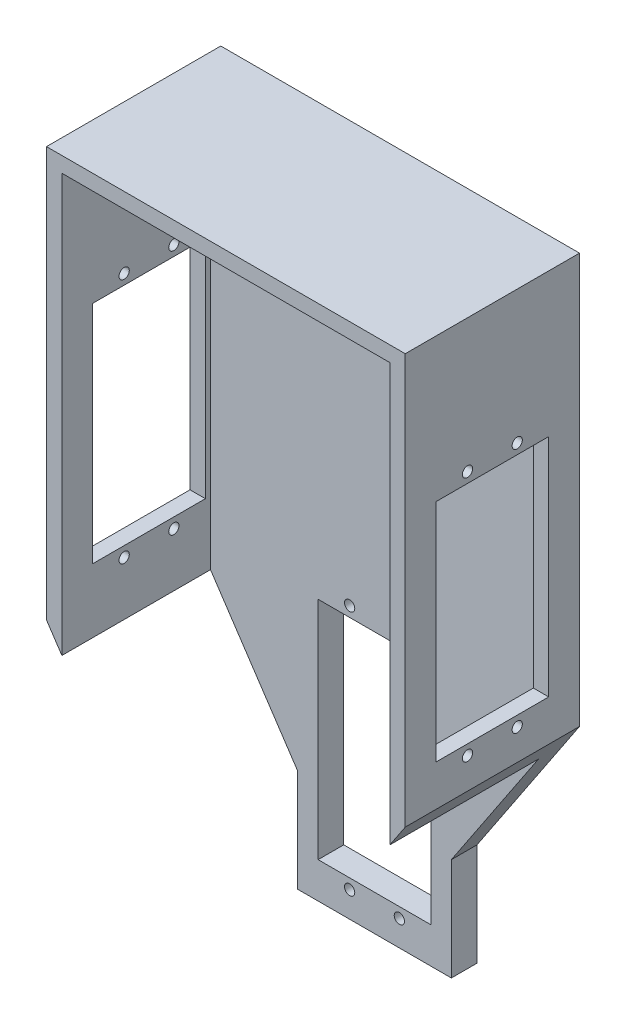
ISO-10303-21;
HEADER;
FILE_DESCRIPTION(('STEP AP214'),'2;1');
FILE_NAME('part.step','',(''),(''),'','','');
FILE_SCHEMA(('AUTOMOTIVE_DESIGN { 1 0 10303 214 1 1 1 1 }'));
ENDSEC;
DATA;
#1=APPLICATION_CONTEXT('core data for automotive mechanical design processes');
#2=APPLICATION_PROTOCOL_DEFINITION('international standard','automotive_design',2000,#1);
#3=PRODUCT_CONTEXT('',#1,'mechanical');
#4=PRODUCT('Part','Part','',(#3));
#5=PRODUCT_RELATED_PRODUCT_CATEGORY('part','',(#4));
#6=PRODUCT_DEFINITION_FORMATION('','',#4);
#7=PRODUCT_DEFINITION_CONTEXT('part definition',#1,'design');
#8=PRODUCT_DEFINITION('design','',#6,#7);
#9=PRODUCT_DEFINITION_SHAPE('','',#8);
#10=(LENGTH_UNIT() NAMED_UNIT(*) SI_UNIT(.MILLI.,.METRE.));
#11=(NAMED_UNIT(*) PLANE_ANGLE_UNIT() SI_UNIT($,.RADIAN.));
#12=(NAMED_UNIT(*) SI_UNIT($,.STERADIAN.) SOLID_ANGLE_UNIT());
#13=UNCERTAINTY_MEASURE_WITH_UNIT(LENGTH_MEASURE(1.E-05),#10,'distance_accuracy_value','');
#14=(GEOMETRIC_REPRESENTATION_CONTEXT(3) GLOBAL_UNCERTAINTY_ASSIGNED_CONTEXT((#13)) GLOBAL_UNIT_ASSIGNED_CONTEXT((#10,
#11,#12)) REPRESENTATION_CONTEXT('',''));
#15=CARTESIAN_POINT('',(0.,0.,0.));
#16=DIRECTION('',(0.,0.,1.));
#17=DIRECTION('',(1.,0.,0.));
#18=AXIS2_PLACEMENT_3D('',#15,#16,#17);
#19=CARTESIAN_POINT('',(0.,0.,2.5));
#20=DIRECTION('',(0.,0.,1.));
#21=DIRECTION('',(1.,0.,0.));
#22=AXIS2_PLACEMENT_3D('',#19,#20,#21);
#23=PLANE('',#22);
#24=CARTESIAN_POINT('',(4.84999999999983,24.,2.5));
#25=DIRECTION('',(0.,0.,1.));
#26=DIRECTION('',(1.,0.,0.));
#27=AXIS2_PLACEMENT_3D('',#24,#25,#26);
#28=CIRCLE('',#27,1.);
#29=CARTESIAN_POINT('',(5.84999999999983,24.,2.5));
#30=VERTEX_POINT('',#29);
#31=EDGE_CURVE('E347',#30,#30,#28,.T.);
#32=ORIENTED_EDGE('',*,*,#31,.F.);
#33=EDGE_LOOP('',(#32));
#34=FACE_BOUND('',#33,.T.);
#35=CARTESIAN_POINT('',(-4.85,-24.,2.5));
#36=DIRECTION('',(0.,0.,1.));
#37=DIRECTION('',(1.,0.,0.));
#38=AXIS2_PLACEMENT_3D('',#35,#36,#37);
#39=CIRCLE('',#38,1.);
#40=CARTESIAN_POINT('',(-3.85,-24.,2.5));
#41=VERTEX_POINT('',#40);
#42=EDGE_CURVE('E363',#41,#41,#39,.T.);
#43=ORIENTED_EDGE('',*,*,#42,.F.);
#44=EDGE_LOOP('',(#43));
#45=FACE_BOUND('',#44,.T.);
#46=DIRECTION('',(1.,0.,0.));
#47=VECTOR('',#46,1.);
#48=CARTESIAN_POINT('',(11.,-22.,2.5));
#49=LINE('',#48,#47);
#50=CARTESIAN_POINT('',(-11.,-22.,2.5));
#51=VERTEX_POINT('',#50);
#52=CARTESIAN_POINT('',(11.,-22.,2.5));
#53=VERTEX_POINT('',#52);
#54=EDGE_CURVE('E374',#51,#53,#49,.T.);
#55=ORIENTED_EDGE('',*,*,#54,.F.);
#56=DIRECTION('',(0.,-1.,0.));
#57=VECTOR('',#56,1.);
#58=CARTESIAN_POINT('',(-11.,-22.,2.5));
#59=LINE('',#58,#57);
#60=CARTESIAN_POINT('',(-11.,22.,2.5));
#61=VERTEX_POINT('',#60);
#62=EDGE_CURVE('E371',#61,#51,#59,.T.);
#63=ORIENTED_EDGE('',*,*,#62,.F.);
#64=DIRECTION('',(-1.,0.,0.));
#65=VECTOR('',#64,1.);
#66=CARTESIAN_POINT('',(11.,22.,2.5));
#67=LINE('',#66,#65);
#68=CARTESIAN_POINT('',(11.,22.,2.5));
#69=VERTEX_POINT('',#68);
#70=EDGE_CURVE('E382',#69,#61,#67,.T.);
#71=ORIENTED_EDGE('',*,*,#70,.F.);
#72=DIRECTION('',(0.,1.,0.));
#73=VECTOR('',#72,1.);
#74=CARTESIAN_POINT('',(11.,-22.,2.5));
#75=LINE('',#74,#73);
#76=EDGE_CURVE('E378',#53,#69,#75,.T.);
#77=ORIENTED_EDGE('',*,*,#76,.F.);
#78=EDGE_LOOP('',(#55,#63,#71,#77));
#79=FACE_BOUND('',#78,.T.);
#80=CARTESIAN_POINT('',(4.85,-24.,2.5));
#81=DIRECTION('',(0.,0.,1.));
#82=DIRECTION('',(1.,0.,0.));
#83=AXIS2_PLACEMENT_3D('',#80,#81,#82);
#84=CIRCLE('',#83,1.);
#85=CARTESIAN_POINT('',(5.85,-24.,2.5));
#86=VERTEX_POINT('',#85);
#87=EDGE_CURVE('E355',#86,#86,#84,.T.);
#88=ORIENTED_EDGE('',*,*,#87,.F.);
#89=EDGE_LOOP('',(#88));
#90=FACE_BOUND('',#89,.T.);
#91=CARTESIAN_POINT('',(-4.85000000000016,24.,2.5));
#92=DIRECTION('',(0.,0.,1.));
#93=DIRECTION('',(1.,0.,0.));
#94=AXIS2_PLACEMENT_3D('',#91,#92,#93);
#95=CIRCLE('',#94,1.);
#96=CARTESIAN_POINT('',(-3.85000000000016,24.,2.5));
#97=VERTEX_POINT('',#96);
#98=EDGE_CURVE('E339',#97,#97,#95,.T.);
#99=ORIENTED_EDGE('',*,*,#98,.F.);
#100=EDGE_LOOP('',(#99));
#101=FACE_BOUND('',#100,.T.);
#102=DIRECTION('',(-1.,0.,0.));
#103=VECTOR('',#102,1.);
#104=CARTESIAN_POINT('',(0.,98.,2.5));
#105=LINE('',#104,#103);
#106=CARTESIAN_POINT('',(32.,98.,2.5));
#107=VERTEX_POINT('',#106);
#108=CARTESIAN_POINT('',(-32.,98.,2.5));
#109=VERTEX_POINT('',#108);
#110=EDGE_CURVE('E335',#107,#109,#105,.T.);
#111=ORIENTED_EDGE('',*,*,#110,.T.);
#112=DIRECTION('',(0.,-1.,0.));
#113=VECTOR('',#112,1.);
#114=CARTESIAN_POINT('',(-32.,0.,2.5));
#115=LINE('',#114,#113);
#116=CARTESIAN_POINT('',(-32.,16.5,2.5));
#117=VERTEX_POINT('',#116);
#118=EDGE_CURVE('E329',#109,#117,#115,.T.);
#119=ORIENTED_EDGE('',*,*,#118,.T.);
#120=DIRECTION('',(0.554700196225229,-0.832050294337843,0.));
#121=VECTOR('',#120,1.);
#122=CARTESIAN_POINT('',(-35.,21.,2.5));
#123=LINE('',#122,#121);
#124=CARTESIAN_POINT('',(-15.,-9.,2.5));
#125=VERTEX_POINT('',#124);
#126=EDGE_CURVE('E428',#117,#125,#123,.T.);
#127=ORIENTED_EDGE('',*,*,#126,.T.);
#128=DIRECTION('',(0.,-1.,0.));
#129=VECTOR('',#128,1.);
#130=CARTESIAN_POINT('',(-15.,-9.,2.5));
#131=LINE('',#130,#129);
#132=CARTESIAN_POINT('',(-15.,-29.,2.5));
#133=VERTEX_POINT('',#132);
#134=EDGE_CURVE('E414',#125,#133,#131,.T.);
#135=ORIENTED_EDGE('',*,*,#134,.T.);
#136=DIRECTION('',(1.,0.,0.));
#137=VECTOR('',#136,1.);
#138=CARTESIAN_POINT('',(-15.,-29.,2.5));
#139=LINE('',#138,#137);
#140=CARTESIAN_POINT('',(15.,-29.,2.5));
#141=VERTEX_POINT('',#140);
#142=EDGE_CURVE('E418',#133,#141,#139,.T.);
#143=ORIENTED_EDGE('',*,*,#142,.T.);
#144=DIRECTION('',(0.,1.,0.));
#145=VECTOR('',#144,1.);
#146=CARTESIAN_POINT('',(15.,-29.,2.5));
#147=LINE('',#146,#145);
#148=CARTESIAN_POINT('',(15.,-9.,2.5));
#149=VERTEX_POINT('',#148);
#150=EDGE_CURVE('E422',#141,#149,#147,.T.);
#151=ORIENTED_EDGE('',*,*,#150,.T.);
#152=DIRECTION('',(0.554700196225229,0.832050294337843,0.));
#153=VECTOR('',#152,1.);
#154=CARTESIAN_POINT('',(15.,-9.,2.5));
#155=LINE('',#154,#153);
#156=CARTESIAN_POINT('',(32.,16.5,2.5));
#157=VERTEX_POINT('',#156);
#158=EDGE_CURVE('E425',#149,#157,#155,.T.);
#159=ORIENTED_EDGE('',*,*,#158,.T.);
#160=DIRECTION('',(0.,1.,0.));
#161=VECTOR('',#160,1.);
#162=CARTESIAN_POINT('',(32.,0.,2.5));
#163=LINE('',#162,#161);
#164=EDGE_CURVE('E332',#157,#107,#163,.T.);
#165=ORIENTED_EDGE('',*,*,#164,.T.);
#166=EDGE_LOOP('',(#111,#119,#127,#135,#143,#151,#159,#165));
#167=FACE_BOUND('',#166,.T.);
#168=ADVANCED_FACE('F39',(#34,#45,#79,#90,#101,#167),#23,.T.);
#169=CARTESIAN_POINT('',(0.,0.,-2.5));
#170=DIRECTION('',(0.,0.,1.));
#171=DIRECTION('',(1.,0.,0.));
#172=AXIS2_PLACEMENT_3D('',#169,#170,#171);
#173=PLANE('',#172);
#174=DIRECTION('',(0.,-1.,0.));
#175=VECTOR('',#174,1.);
#176=CARTESIAN_POINT('',(-15.,-9.,-2.5));
#177=LINE('',#176,#175);
#178=CARTESIAN_POINT('',(-15.,-9.,-2.5));
#179=VERTEX_POINT('',#178);
#180=CARTESIAN_POINT('',(-15.,-29.,-2.5));
#181=VERTEX_POINT('',#180);
#182=EDGE_CURVE('E413',#179,#181,#177,.T.);
#183=ORIENTED_EDGE('',*,*,#182,.F.);
#184=DIRECTION('',(0.554700196225229,-0.832050294337843,0.));
#185=VECTOR('',#184,1.);
#186=CARTESIAN_POINT('',(-35.,21.,-2.5));
#187=LINE('',#186,#185);
#188=CARTESIAN_POINT('',(-35.,21.,-2.5));
#189=VERTEX_POINT('',#188);
#190=EDGE_CURVE('E419',#189,#179,#187,.T.);
#191=ORIENTED_EDGE('',*,*,#190,.F.);
#192=DIRECTION('',(0.,-1.,0.));
#193=VECTOR('',#192,1.);
#194=CARTESIAN_POINT('',(-35.,101.,-2.5));
#195=LINE('',#194,#193);
#196=CARTESIAN_POINT('',(-35.,101.,-2.5));
#197=VERTEX_POINT('',#196);
#198=EDGE_CURVE('E450',#197,#189,#195,.T.);
#199=ORIENTED_EDGE('',*,*,#198,.F.);
#200=DIRECTION('',(-1.,0.,0.));
#201=VECTOR('',#200,1.);
#202=CARTESIAN_POINT('',(35.,101.,-2.5));
#203=LINE('',#202,#201);
#204=CARTESIAN_POINT('',(35.,101.,-2.5));
#205=VERTEX_POINT('',#204);
#206=EDGE_CURVE('E447',#205,#197,#203,.T.);
#207=ORIENTED_EDGE('',*,*,#206,.F.);
#208=DIRECTION('',(0.,1.,0.));
#209=VECTOR('',#208,1.);
#210=CARTESIAN_POINT('',(35.,21.,-2.5));
#211=LINE('',#210,#209);
#212=CARTESIAN_POINT('',(35.,21.,-2.5));
#213=VERTEX_POINT('',#212);
#214=EDGE_CURVE('E444',#213,#205,#211,.T.);
#215=ORIENTED_EDGE('',*,*,#214,.F.);
#216=DIRECTION('',(0.554700196225229,0.832050294337843,0.));
#217=VECTOR('',#216,1.);
#218=CARTESIAN_POINT('',(15.,-9.,-2.5));
#219=LINE('',#218,#217);
#220=CARTESIAN_POINT('',(15.,-9.,-2.5));
#221=VERTEX_POINT('',#220);
#222=EDGE_CURVE('E441',#221,#213,#219,.T.);
#223=ORIENTED_EDGE('',*,*,#222,.F.);
#224=DIRECTION('',(0.,1.,0.));
#225=VECTOR('',#224,1.);
#226=CARTESIAN_POINT('',(15.,-29.,-2.5));
#227=LINE('',#226,#225);
#228=CARTESIAN_POINT('',(15.,-29.,-2.5));
#229=VERTEX_POINT('',#228);
#230=EDGE_CURVE('E438',#229,#221,#227,.T.);
#231=ORIENTED_EDGE('',*,*,#230,.F.);
#232=DIRECTION('',(1.,0.,0.));
#233=VECTOR('',#232,1.);
#234=CARTESIAN_POINT('',(-15.,-29.,-2.5));
#235=LINE('',#234,#233);
#236=EDGE_CURVE('E435',#181,#229,#235,.T.);
#237=ORIENTED_EDGE('',*,*,#236,.F.);
#238=EDGE_LOOP('',(#183,#191,#199,#207,#215,#223,#231,#237));
#239=FACE_BOUND('',#238,.T.);
#240=CARTESIAN_POINT('',(-4.85000000000016,24.,-2.5));
#241=DIRECTION('',(0.,0.,1.));
#242=DIRECTION('',(1.,0.,0.));
#243=AXIS2_PLACEMENT_3D('',#240,#241,#242);
#244=CIRCLE('',#243,1.);
#245=CARTESIAN_POINT('',(-3.85000000000016,24.,-2.5));
#246=VERTEX_POINT('',#245);
#247=EDGE_CURVE('E338',#246,#246,#244,.T.);
#248=ORIENTED_EDGE('',*,*,#247,.T.);
#249=EDGE_LOOP('',(#248));
#250=FACE_BOUND('',#249,.T.);
#251=CARTESIAN_POINT('',(4.84999999999983,24.,-2.5));
#252=DIRECTION('',(0.,0.,1.));
#253=DIRECTION('',(1.,0.,0.));
#254=AXIS2_PLACEMENT_3D('',#251,#252,#253);
#255=CIRCLE('',#254,1.);
#256=CARTESIAN_POINT('',(5.84999999999983,24.,-2.5));
#257=VERTEX_POINT('',#256);
#258=EDGE_CURVE('E343',#257,#257,#255,.T.);
#259=ORIENTED_EDGE('',*,*,#258,.T.);
#260=EDGE_LOOP('',(#259));
#261=FACE_BOUND('',#260,.T.);
#262=CARTESIAN_POINT('',(4.85,-24.,-2.5));
#263=DIRECTION('',(0.,0.,1.));
#264=DIRECTION('',(1.,0.,0.));
#265=AXIS2_PLACEMENT_3D('',#262,#263,#264);
#266=CIRCLE('',#265,1.);
#267=CARTESIAN_POINT('',(5.85,-24.,-2.5));
#268=VERTEX_POINT('',#267);
#269=EDGE_CURVE('E351',#268,#268,#266,.T.);
#270=ORIENTED_EDGE('',*,*,#269,.T.);
#271=EDGE_LOOP('',(#270));
#272=FACE_BOUND('',#271,.T.);
#273=CARTESIAN_POINT('',(-4.85,-24.,-2.5));
#274=DIRECTION('',(0.,0.,1.));
#275=DIRECTION('',(1.,0.,0.));
#276=AXIS2_PLACEMENT_3D('',#273,#274,#275);
#277=CIRCLE('',#276,1.);
#278=CARTESIAN_POINT('',(-3.85,-24.,-2.5));
#279=VERTEX_POINT('',#278);
#280=EDGE_CURVE('E359',#279,#279,#277,.T.);
#281=ORIENTED_EDGE('',*,*,#280,.T.);
#282=EDGE_LOOP('',(#281));
#283=FACE_BOUND('',#282,.T.);
#284=DIRECTION('',(0.,-1.,0.));
#285=VECTOR('',#284,1.);
#286=CARTESIAN_POINT('',(-11.,-22.,-2.5));
#287=LINE('',#286,#285);
#288=CARTESIAN_POINT('',(-11.,22.,-2.5));
#289=VERTEX_POINT('',#288);
#290=CARTESIAN_POINT('',(-11.,-22.,-2.5));
#291=VERTEX_POINT('',#290);
#292=EDGE_CURVE('E367',#289,#291,#287,.T.);
#293=ORIENTED_EDGE('',*,*,#292,.T.);
#294=DIRECTION('',(1.,0.,0.));
#295=VECTOR('',#294,1.);
#296=CARTESIAN_POINT('',(11.,-22.,-2.5));
#297=LINE('',#296,#295);
#298=CARTESIAN_POINT('',(11.,-22.,-2.5));
#299=VERTEX_POINT('',#298);
#300=EDGE_CURVE('E389',#291,#299,#297,.T.);
#301=ORIENTED_EDGE('',*,*,#300,.T.);
#302=DIRECTION('',(0.,1.,0.));
#303=VECTOR('',#302,1.);
#304=CARTESIAN_POINT('',(11.,-22.,-2.5));
#305=LINE('',#304,#303);
#306=CARTESIAN_POINT('',(11.,22.,-2.5));
#307=VERTEX_POINT('',#306);
#308=EDGE_CURVE('E393',#299,#307,#305,.T.);
#309=ORIENTED_EDGE('',*,*,#308,.T.);
#310=DIRECTION('',(-1.,0.,0.));
#311=VECTOR('',#310,1.);
#312=CARTESIAN_POINT('',(11.,22.,-2.5));
#313=LINE('',#312,#311);
#314=EDGE_CURVE('E375',#307,#289,#313,.T.);
#315=ORIENTED_EDGE('',*,*,#314,.T.);
#316=EDGE_LOOP('',(#293,#301,#309,#315));
#317=FACE_BOUND('',#316,.T.);
#318=ADVANCED_FACE('F532',(#239,#250,#261,#272,#283,#317),#173,.F.);
#319=CARTESIAN_POINT('',(-15.,-9.,2.5));
#320=DIRECTION('',(1.,0.,0.));
#321=DIRECTION('',(0.,1.,0.));
#322=AXIS2_PLACEMENT_3D('',#319,#320,#321);
#323=PLANE('',#322);
#324=ORIENTED_EDGE('',*,*,#182,.T.);
#325=DIRECTION('',(0.,0.,-1.));
#326=VECTOR('',#325,1.);
#327=CARTESIAN_POINT('',(-15.,-29.,2.5));
#328=LINE('',#327,#326);
#329=EDGE_CURVE('E482',#133,#181,#328,.T.);
#330=ORIENTED_EDGE('',*,*,#329,.F.);
#331=ORIENTED_EDGE('',*,*,#134,.F.);
#332=DIRECTION('',(0.,0.,-1.));
#333=VECTOR('',#332,1.);
#334=CARTESIAN_POINT('',(-15.,-9.,2.5));
#335=LINE('',#334,#333);
#336=EDGE_CURVE('E431',#125,#179,#335,.T.);
#337=ORIENTED_EDGE('',*,*,#336,.T.);
#338=EDGE_LOOP('',(#324,#330,#331,#337));
#339=FACE_BOUND('',#338,.T.);
#340=ADVANCED_FACE('F41',(#339),#323,.F.);
#341=CARTESIAN_POINT('',(-15.,-29.,2.5));
#342=DIRECTION('',(0.,1.,0.));
#343=DIRECTION('',(0.,0.,1.));
#344=AXIS2_PLACEMENT_3D('',#341,#342,#343);
#345=PLANE('',#344);
#346=ORIENTED_EDGE('',*,*,#236,.T.);
#347=DIRECTION('',(0.,0.,-1.));
#348=VECTOR('',#347,1.);
#349=CARTESIAN_POINT('',(15.,-29.,2.5));
#350=LINE('',#349,#348);
#351=EDGE_CURVE('E478',#141,#229,#350,.T.);
#352=ORIENTED_EDGE('',*,*,#351,.F.);
#353=ORIENTED_EDGE('',*,*,#142,.F.);
#354=ORIENTED_EDGE('',*,*,#329,.T.);
#355=EDGE_LOOP('',(#346,#352,#353,#354));
#356=FACE_BOUND('',#355,.T.);
#357=ADVANCED_FACE('F567',(#356),#345,.F.);
#358=CARTESIAN_POINT('',(15.,-29.,2.5));
#359=DIRECTION('',(-1.,0.,0.));
#360=DIRECTION('',(0.,-1.,0.));
#361=AXIS2_PLACEMENT_3D('',#358,#359,#360);
#362=PLANE('',#361);
#363=ORIENTED_EDGE('',*,*,#230,.T.);
#364=DIRECTION('',(0.,0.,-1.));
#365=VECTOR('',#364,1.);
#366=CARTESIAN_POINT('',(15.,-9.,2.5));
#367=LINE('',#366,#365);
#368=EDGE_CURVE('E474',#149,#221,#367,.T.);
#369=ORIENTED_EDGE('',*,*,#368,.F.);
#370=ORIENTED_EDGE('',*,*,#150,.F.);
#371=ORIENTED_EDGE('',*,*,#351,.T.);
#372=EDGE_LOOP('',(#363,#369,#370,#371));
#373=FACE_BOUND('',#372,.T.);
#374=ADVANCED_FACE('F564',(#373),#362,.F.);
#375=CARTESIAN_POINT('',(15.,-9.,2.5));
#376=DIRECTION('',(-0.832050294337844,0.554700196225229,0.));
#377=DIRECTION('',(-0.554700196225229,-0.832050294337844,0.));
#378=AXIS2_PLACEMENT_3D('',#375,#376,#377);
#379=PLANE('',#378);
#380=DIRECTION('',(0.,0.,-1.));
#381=VECTOR('',#380,1.);
#382=CARTESIAN_POINT('',(35.,21.,2.5));
#383=LINE('',#382,#381);
#384=CARTESIAN_POINT('',(35.,21.,31.5));
#385=VERTEX_POINT('',#384);
#386=EDGE_CURVE('E470',#385,#213,#383,.T.);
#387=ORIENTED_EDGE('',*,*,#386,.F.);
#388=DIRECTION('',(0.554700196225229,0.832050294337844,0.));
#389=VECTOR('',#388,1.);
#390=CARTESIAN_POINT('',(32.,16.5,31.5));
#391=LINE('',#390,#389);
#392=CARTESIAN_POINT('',(32.,16.5,31.5));
#393=VERTEX_POINT('',#392);
#394=EDGE_CURVE('E305',#393,#385,#391,.T.);
#395=ORIENTED_EDGE('',*,*,#394,.F.);
#396=DIRECTION('',(0.,0.,-1.));
#397=VECTOR('',#396,1.);
#398=CARTESIAN_POINT('',(32.,16.5,31.5));
#399=LINE('',#398,#397);
#400=EDGE_CURVE('E313',#393,#157,#399,.T.);
#401=ORIENTED_EDGE('',*,*,#400,.T.);
#402=ORIENTED_EDGE('',*,*,#158,.F.);
#403=ORIENTED_EDGE('',*,*,#368,.T.);
#404=ORIENTED_EDGE('',*,*,#222,.T.);
#405=EDGE_LOOP('',(#387,#395,#401,#402,#403,#404));
#406=FACE_BOUND('',#405,.T.);
#407=ADVANCED_FACE('F560',(#406),#379,.F.);
#408=CARTESIAN_POINT('',(35.,21.,2.5));
#409=DIRECTION('',(-1.,0.,0.));
#410=DIRECTION('',(0.,-1.,0.));
#411=AXIS2_PLACEMENT_3D('',#408,#409,#410);
#412=PLANE('',#411);
#413=CARTESIAN_POINT('',(35.,75.,9.65));
#414=DIRECTION('',(-1.,0.,0.));
#415=DIRECTION('',(0.,-1.,0.));
#416=AXIS2_PLACEMENT_3D('',#413,#414,#415);
#417=CIRCLE('',#416,1.);
#418=CARTESIAN_POINT('',(35.,74.,9.65));
#419=VERTEX_POINT('',#418);
#420=EDGE_CURVE('E993',#419,#419,#417,.F.);
#421=ORIENTED_EDGE('',*,*,#420,.F.);
#422=EDGE_LOOP('',(#421));
#423=FACE_BOUND('',#422,.T.);
#424=CARTESIAN_POINT('',(35.,75.,19.35));
#425=DIRECTION('',(-1.,0.,0.));
#426=DIRECTION('',(0.,-1.,0.));
#427=AXIS2_PLACEMENT_3D('',#424,#425,#426);
#428=CIRCLE('',#427,1.);
#429=CARTESIAN_POINT('',(35.,74.,19.35));
#430=VERTEX_POINT('',#429);
#431=EDGE_CURVE('E985',#430,#430,#428,.F.);
#432=ORIENTED_EDGE('',*,*,#431,.F.);
#433=EDGE_LOOP('',(#432));
#434=FACE_BOUND('',#433,.T.);
#435=CARTESIAN_POINT('',(35.,27.,19.35));
#436=DIRECTION('',(-1.,0.,0.));
#437=DIRECTION('',(0.,-1.,0.));
#438=AXIS2_PLACEMENT_3D('',#435,#436,#437);
#439=CIRCLE('',#438,1.);
#440=CARTESIAN_POINT('',(35.,26.,19.35));
#441=VERTEX_POINT('',#440);
#442=EDGE_CURVE('E978',#441,#441,#439,.F.);
#443=ORIENTED_EDGE('',*,*,#442,.F.);
#444=EDGE_LOOP('',(#443));
#445=FACE_BOUND('',#444,.T.);
#446=CARTESIAN_POINT('',(35.,27.,9.65));
#447=DIRECTION('',(-1.,0.,0.));
#448=DIRECTION('',(0.,-1.,0.));
#449=AXIS2_PLACEMENT_3D('',#446,#447,#448);
#450=CIRCLE('',#449,1.);
#451=CARTESIAN_POINT('',(35.,26.,9.65));
#452=VERTEX_POINT('',#451);
#453=EDGE_CURVE('E970',#452,#452,#450,.F.);
#454=ORIENTED_EDGE('',*,*,#453,.F.);
#455=EDGE_LOOP('',(#454));
#456=FACE_BOUND('',#455,.T.);
#457=DIRECTION('',(0.,0.,-1.));
#458=VECTOR('',#457,1.);
#459=CARTESIAN_POINT('',(35.,29.,3.5));
#460=LINE('',#459,#458);
#461=CARTESIAN_POINT('',(35.,29.,25.5));
#462=VERTEX_POINT('',#461);
#463=CARTESIAN_POINT('',(35.,29.,3.5));
#464=VERTEX_POINT('',#463);
#465=EDGE_CURVE('E961',#462,#464,#460,.T.);
#466=ORIENTED_EDGE('',*,*,#465,.F.);
#467=DIRECTION('',(0.,-1.,0.));
#468=VECTOR('',#467,1.);
#469=CARTESIAN_POINT('',(35.,29.,25.5));
#470=LINE('',#469,#468);
#471=CARTESIAN_POINT('',(35.,73.,25.5));
#472=VERTEX_POINT('',#471);
#473=EDGE_CURVE('E253',#472,#462,#470,.T.);
#474=ORIENTED_EDGE('',*,*,#473,.F.);
#475=DIRECTION('',(0.,0.,1.));
#476=VECTOR('',#475,1.);
#477=CARTESIAN_POINT('',(35.,73.,3.5));
#478=LINE('',#477,#476);
#479=CARTESIAN_POINT('',(35.,73.,3.5));
#480=VERTEX_POINT('',#479);
#481=EDGE_CURVE('E249',#480,#472,#478,.T.);
#482=ORIENTED_EDGE('',*,*,#481,.F.);
#483=DIRECTION('',(0.,1.,0.));
#484=VECTOR('',#483,1.);
#485=CARTESIAN_POINT('',(35.,29.,3.5));
#486=LINE('',#485,#484);
#487=EDGE_CURVE('E239',#464,#480,#486,.T.);
#488=ORIENTED_EDGE('',*,*,#487,.F.);
#489=EDGE_LOOP('',(#466,#474,#482,#488));
#490=FACE_BOUND('',#489,.T.);
#491=ORIENTED_EDGE('',*,*,#214,.T.);
#492=DIRECTION('',(0.,0.,-1.));
#493=VECTOR('',#492,1.);
#494=CARTESIAN_POINT('',(35.,101.,2.5));
#495=LINE('',#494,#493);
#496=CARTESIAN_POINT('',(35.,101.,31.5));
#497=VERTEX_POINT('',#496);
#498=EDGE_CURVE('E466',#497,#205,#495,.T.);
#499=ORIENTED_EDGE('',*,*,#498,.F.);
#500=DIRECTION('',(0.,1.,0.));
#501=VECTOR('',#500,1.);
#502=CARTESIAN_POINT('',(35.,21.,31.5));
#503=LINE('',#502,#501);
#504=EDGE_CURVE('E309',#385,#497,#503,.T.);
#505=ORIENTED_EDGE('',*,*,#504,.F.);
#506=ORIENTED_EDGE('',*,*,#386,.T.);
#507=EDGE_LOOP('',(#491,#499,#505,#506));
#508=FACE_BOUND('',#507,.T.);
#509=ADVANCED_FACE('F556',(#423,#434,#445,#456,#490,#508),#412,.F.);
#510=CARTESIAN_POINT('',(35.,101.,2.5));
#511=DIRECTION('',(0.,-1.,0.));
#512=DIRECTION('',(0.,0.,-1.));
#513=AXIS2_PLACEMENT_3D('',#510,#511,#512);
#514=PLANE('',#513);
#515=ORIENTED_EDGE('',*,*,#206,.T.);
#516=DIRECTION('',(0.,0.,-1.));
#517=VECTOR('',#516,1.);
#518=CARTESIAN_POINT('',(-35.,101.,2.5));
#519=LINE('',#518,#517);
#520=CARTESIAN_POINT('',(-35.,101.,31.5));
#521=VERTEX_POINT('',#520);
#522=EDGE_CURVE('E462',#521,#197,#519,.T.);
#523=ORIENTED_EDGE('',*,*,#522,.F.);
#524=DIRECTION('',(-1.,0.,0.));
#525=VECTOR('',#524,1.);
#526=CARTESIAN_POINT('',(-35.,101.,31.5));
#527=LINE('',#526,#525);
#528=EDGE_CURVE('E285',#497,#521,#527,.T.);
#529=ORIENTED_EDGE('',*,*,#528,.F.);
#530=ORIENTED_EDGE('',*,*,#498,.T.);
#531=EDGE_LOOP('',(#515,#523,#529,#530));
#532=FACE_BOUND('',#531,.T.);
#533=ADVANCED_FACE('F552',(#532),#514,.F.);
#534=CARTESIAN_POINT('',(-35.,101.,2.5));
#535=DIRECTION('',(1.,0.,0.));
#536=DIRECTION('',(0.,1.,0.));
#537=AXIS2_PLACEMENT_3D('',#534,#535,#536);
#538=PLANE('',#537);
#539=CARTESIAN_POINT('',(-35.,75.,9.65));
#540=DIRECTION('',(-1.,0.,0.));
#541=DIRECTION('',(0.,0.,1.));
#542=AXIS2_PLACEMENT_3D('',#539,#540,#541);
#543=CIRCLE('',#542,1.);
#544=CARTESIAN_POINT('',(-35.,75.,10.65));
#545=VERTEX_POINT('',#544);
#546=EDGE_CURVE('E946',#545,#545,#543,.T.);
#547=ORIENTED_EDGE('',*,*,#546,.F.);
#548=EDGE_LOOP('',(#547));
#549=FACE_BOUND('',#548,.T.);
#550=CARTESIAN_POINT('',(-35.,75.,19.35));
#551=DIRECTION('',(-1.,0.,0.));
#552=DIRECTION('',(0.,0.,1.));
#553=AXIS2_PLACEMENT_3D('',#550,#551,#552);
#554=CIRCLE('',#553,1.);
#555=CARTESIAN_POINT('',(-35.,75.,20.35));
#556=VERTEX_POINT('',#555);
#557=EDGE_CURVE('E989',#556,#556,#554,.T.);
#558=ORIENTED_EDGE('',*,*,#557,.F.);
#559=EDGE_LOOP('',(#558));
#560=FACE_BOUND('',#559,.T.);
#561=CARTESIAN_POINT('',(-35.,27.,19.35));
#562=DIRECTION('',(-1.,0.,0.));
#563=DIRECTION('',(0.,0.,1.));
#564=AXIS2_PLACEMENT_3D('',#561,#562,#563);
#565=CIRCLE('',#564,1.);
#566=CARTESIAN_POINT('',(-35.,27.,20.35));
#567=VERTEX_POINT('',#566);
#568=EDGE_CURVE('E981',#567,#567,#565,.T.);
#569=ORIENTED_EDGE('',*,*,#568,.F.);
#570=EDGE_LOOP('',(#569));
#571=FACE_BOUND('',#570,.T.);
#572=CARTESIAN_POINT('',(-35.,27.,9.65));
#573=DIRECTION('',(-1.,0.,0.));
#574=DIRECTION('',(0.,0.,1.));
#575=AXIS2_PLACEMENT_3D('',#572,#573,#574);
#576=CIRCLE('',#575,1.);
#577=CARTESIAN_POINT('',(-35.,27.,10.65));
#578=VERTEX_POINT('',#577);
#579=EDGE_CURVE('E973',#578,#578,#576,.T.);
#580=ORIENTED_EDGE('',*,*,#579,.F.);
#581=EDGE_LOOP('',(#580));
#582=FACE_BOUND('',#581,.T.);
#583=DIRECTION('',(0.,0.,-1.));
#584=VECTOR('',#583,1.);
#585=CARTESIAN_POINT('',(-35.,73.,3.5));
#586=LINE('',#585,#584);
#587=CARTESIAN_POINT('',(-35.,73.,25.5));
#588=VERTEX_POINT('',#587);
#589=CARTESIAN_POINT('',(-35.,73.,3.5));
#590=VERTEX_POINT('',#589);
#591=EDGE_CURVE('E219',#588,#590,#586,.T.);
#592=ORIENTED_EDGE('',*,*,#591,.F.);
#593=DIRECTION('',(0.,1.,0.));
#594=VECTOR('',#593,1.);
#595=CARTESIAN_POINT('',(-35.,29.,25.5));
#596=LINE('',#595,#594);
#597=CARTESIAN_POINT('',(-35.,29.,25.5));
#598=VERTEX_POINT('',#597);
#599=EDGE_CURVE('E65',#598,#588,#596,.T.);
#600=ORIENTED_EDGE('',*,*,#599,.F.);
#601=DIRECTION('',(0.,0.,1.));
#602=VECTOR('',#601,1.);
#603=CARTESIAN_POINT('',(-35.,29.,3.5));
#604=LINE('',#603,#602);
#605=CARTESIAN_POINT('',(-35.,29.,3.5));
#606=VERTEX_POINT('',#605);
#607=EDGE_CURVE('E228',#606,#598,#604,.T.);
#608=ORIENTED_EDGE('',*,*,#607,.F.);
#609=DIRECTION('',(0.,-1.,0.));
#610=VECTOR('',#609,1.);
#611=CARTESIAN_POINT('',(-35.,29.,3.5));
#612=LINE('',#611,#610);
#613=EDGE_CURVE('E209',#590,#606,#612,.T.);
#614=ORIENTED_EDGE('',*,*,#613,.F.);
#615=EDGE_LOOP('',(#592,#600,#608,#614));
#616=FACE_BOUND('',#615,.T.);
#617=ORIENTED_EDGE('',*,*,#198,.T.);
#618=DIRECTION('',(0.,0.,-1.));
#619=VECTOR('',#618,1.);
#620=CARTESIAN_POINT('',(-35.,21.,2.5));
#621=LINE('',#620,#619);
#622=CARTESIAN_POINT('',(-35.,21.,31.5));
#623=VERTEX_POINT('',#622);
#624=EDGE_CURVE('E458',#623,#189,#621,.T.);
#625=ORIENTED_EDGE('',*,*,#624,.F.);
#626=DIRECTION('',(0.,-1.,0.));
#627=VECTOR('',#626,1.);
#628=CARTESIAN_POINT('',(-35.,101.,31.5));
#629=LINE('',#628,#627);
#630=EDGE_CURVE('E289',#521,#623,#629,.T.);
#631=ORIENTED_EDGE('',*,*,#630,.F.);
#632=ORIENTED_EDGE('',*,*,#522,.T.);
#633=EDGE_LOOP('',(#617,#625,#631,#632));
#634=FACE_BOUND('',#633,.T.);
#635=ADVANCED_FACE('F225',(#549,#560,#571,#582,#616,#634),#538,.F.);
#636=CARTESIAN_POINT('',(-35.,21.,2.5));
#637=DIRECTION('',(0.832050294337844,0.554700196225229,0.));
#638=DIRECTION('',(-0.554700196225229,0.832050294337844,0.));
#639=AXIS2_PLACEMENT_3D('',#636,#637,#638);
#640=PLANE('',#639);
#641=ORIENTED_EDGE('',*,*,#190,.T.);
#642=ORIENTED_EDGE('',*,*,#336,.F.);
#643=ORIENTED_EDGE('',*,*,#126,.F.);
#644=DIRECTION('',(0.,0.,-1.));
#645=VECTOR('',#644,1.);
#646=CARTESIAN_POINT('',(-32.,16.5,31.5));
#647=LINE('',#646,#645);
#648=CARTESIAN_POINT('',(-32.,16.5,31.5));
#649=VERTEX_POINT('',#648);
#650=EDGE_CURVE('E325',#649,#117,#647,.T.);
#651=ORIENTED_EDGE('',*,*,#650,.F.);
#652=DIRECTION('',(0.55470019622523,-0.832050294337843,0.));
#653=VECTOR('',#652,1.);
#654=CARTESIAN_POINT('',(-35.,21.,31.5));
#655=LINE('',#654,#653);
#656=EDGE_CURVE('E293',#623,#649,#655,.T.);
#657=ORIENTED_EDGE('',*,*,#656,.F.);
#658=ORIENTED_EDGE('',*,*,#624,.T.);
#659=EDGE_LOOP('',(#641,#642,#643,#651,#657,#658));
#660=FACE_BOUND('',#659,.T.);
#661=ADVANCED_FACE('F546',(#660),#640,.F.);
#662=CARTESIAN_POINT('',(-11.,-22.,2.5));
#663=DIRECTION('',(1.,0.,0.));
#664=DIRECTION('',(0.,0.,-1.));
#665=AXIS2_PLACEMENT_3D('',#662,#663,#664);
#666=PLANE('',#665);
#667=ORIENTED_EDGE('',*,*,#292,.F.);
#668=DIRECTION('',(0.,0.,-1.));
#669=VECTOR('',#668,1.);
#670=CARTESIAN_POINT('',(-11.,22.,2.5));
#671=LINE('',#670,#669);
#672=EDGE_CURVE('E385',#61,#289,#671,.T.);
#673=ORIENTED_EDGE('',*,*,#672,.F.);
#674=ORIENTED_EDGE('',*,*,#62,.T.);
#675=DIRECTION('',(0.,0.,-1.));
#676=VECTOR('',#675,1.);
#677=CARTESIAN_POINT('',(-11.,-22.,2.5));
#678=LINE('',#677,#676);
#679=EDGE_CURVE('E409',#51,#291,#678,.T.);
#680=ORIENTED_EDGE('',*,*,#679,.T.);
#681=EDGE_LOOP('',(#667,#673,#674,#680));
#682=FACE_BOUND('',#681,.T.);
#683=ADVANCED_FACE('F543',(#682),#666,.T.);
#684=CARTESIAN_POINT('',(11.,-22.,2.5));
#685=DIRECTION('',(0.,1.,0.));
#686=DIRECTION('',(0.,0.,1.));
#687=AXIS2_PLACEMENT_3D('',#684,#685,#686);
#688=PLANE('',#687);
#689=ORIENTED_EDGE('',*,*,#300,.F.);
#690=ORIENTED_EDGE('',*,*,#679,.F.);
#691=ORIENTED_EDGE('',*,*,#54,.T.);
#692=DIRECTION('',(0.,0.,-1.));
#693=VECTOR('',#692,1.);
#694=CARTESIAN_POINT('',(11.,-22.,2.5));
#695=LINE('',#694,#693);
#696=EDGE_CURVE('E406',#53,#299,#695,.T.);
#697=ORIENTED_EDGE('',*,*,#696,.T.);
#698=EDGE_LOOP('',(#689,#690,#691,#697));
#699=FACE_BOUND('',#698,.T.);
#700=ADVANCED_FACE('F653',(#699),#688,.T.);
#701=CARTESIAN_POINT('',(11.,-22.,2.5));
#702=DIRECTION('',(-1.,0.,0.));
#703=DIRECTION('',(0.,0.,1.));
#704=AXIS2_PLACEMENT_3D('',#701,#702,#703);
#705=PLANE('',#704);
#706=ORIENTED_EDGE('',*,*,#308,.F.);
#707=ORIENTED_EDGE('',*,*,#696,.F.);
#708=ORIENTED_EDGE('',*,*,#76,.T.);
#709=DIRECTION('',(0.,0.,-1.));
#710=VECTOR('',#709,1.);
#711=CARTESIAN_POINT('',(11.,22.,2.5));
#712=LINE('',#711,#710);
#713=EDGE_CURVE('E403',#69,#307,#712,.T.);
#714=ORIENTED_EDGE('',*,*,#713,.T.);
#715=EDGE_LOOP('',(#706,#707,#708,#714));
#716=FACE_BOUND('',#715,.T.);
#717=ADVANCED_FACE('F650',(#716),#705,.T.);
#718=CARTESIAN_POINT('',(11.,22.,2.5));
#719=DIRECTION('',(0.,-1.,0.));
#720=DIRECTION('',(0.,0.,-1.));
#721=AXIS2_PLACEMENT_3D('',#718,#719,#720);
#722=PLANE('',#721);
#723=ORIENTED_EDGE('',*,*,#314,.F.);
#724=ORIENTED_EDGE('',*,*,#713,.F.);
#725=ORIENTED_EDGE('',*,*,#70,.T.);
#726=ORIENTED_EDGE('',*,*,#672,.T.);
#727=EDGE_LOOP('',(#723,#724,#725,#726));
#728=FACE_BOUND('',#727,.T.);
#729=ADVANCED_FACE('F646',(#728),#722,.T.);
#730=CARTESIAN_POINT('',(-4.85,-24.,2.5));
#731=DIRECTION('',(0.,0.,-1.));
#732=DIRECTION('',(-1.,0.,0.));
#733=AXIS2_PLACEMENT_3D('',#730,#731,#732);
#734=CYLINDRICAL_SURFACE('',#733,1.);
#735=ORIENTED_EDGE('',*,*,#42,.T.);
#736=EDGE_LOOP('',(#735));
#737=FACE_BOUND('',#736,.T.);
#738=ORIENTED_EDGE('',*,*,#280,.F.);
#739=EDGE_LOOP('',(#738));
#740=FACE_BOUND('',#739,.T.);
#741=ADVANCED_FACE('F642',(#737,#740),#734,.F.);
#742=CARTESIAN_POINT('',(4.85,-24.,2.5));
#743=DIRECTION('',(0.,0.,-1.));
#744=DIRECTION('',(-1.,0.,0.));
#745=AXIS2_PLACEMENT_3D('',#742,#743,#744);
#746=CYLINDRICAL_SURFACE('',#745,1.);
#747=ORIENTED_EDGE('',*,*,#87,.T.);
#748=EDGE_LOOP('',(#747));
#749=FACE_BOUND('',#748,.T.);
#750=ORIENTED_EDGE('',*,*,#269,.F.);
#751=EDGE_LOOP('',(#750));
#752=FACE_BOUND('',#751,.T.);
#753=ADVANCED_FACE('F638',(#749,#752),#746,.F.);
#754=CARTESIAN_POINT('',(4.84999999999983,24.,2.5));
#755=DIRECTION('',(0.,0.,-1.));
#756=DIRECTION('',(-1.,0.,0.));
#757=AXIS2_PLACEMENT_3D('',#754,#755,#756);
#758=CYLINDRICAL_SURFACE('',#757,1.);
#759=ORIENTED_EDGE('',*,*,#31,.T.);
#760=EDGE_LOOP('',(#759));
#761=FACE_BOUND('',#760,.T.);
#762=ORIENTED_EDGE('',*,*,#258,.F.);
#763=EDGE_LOOP('',(#762));
#764=FACE_BOUND('',#763,.T.);
#765=ADVANCED_FACE('F634',(#761,#764),#758,.F.);
#766=CARTESIAN_POINT('',(-4.85000000000016,24.,2.5));
#767=DIRECTION('',(0.,0.,-1.));
#768=DIRECTION('',(-1.,0.,0.));
#769=AXIS2_PLACEMENT_3D('',#766,#767,#768);
#770=CYLINDRICAL_SURFACE('',#769,1.);
#771=ORIENTED_EDGE('',*,*,#98,.T.);
#772=EDGE_LOOP('',(#771));
#773=FACE_BOUND('',#772,.T.);
#774=ORIENTED_EDGE('',*,*,#247,.F.);
#775=EDGE_LOOP('',(#774));
#776=FACE_BOUND('',#775,.T.);
#777=ADVANCED_FACE('F630',(#773,#776),#770,.F.);
#778=CARTESIAN_POINT('',(-32.,98.,31.5));
#779=DIRECTION('',(-1.,0.,0.));
#780=DIRECTION('',(0.,0.,1.));
#781=AXIS2_PLACEMENT_3D('',#778,#779,#780);
#782=PLANE('',#781);
#783=CARTESIAN_POINT('',(-32.,75.,9.65));
#784=DIRECTION('',(-1.,0.,0.));
#785=DIRECTION('',(0.,0.,1.));
#786=AXIS2_PLACEMENT_3D('',#783,#784,#785);
#787=CIRCLE('',#786,1.);
#788=CARTESIAN_POINT('',(-32.,75.,10.65));
#789=VERTEX_POINT('',#788);
#790=EDGE_CURVE('E281',#789,#789,#787,.T.);
#791=ORIENTED_EDGE('',*,*,#790,.T.);
#792=EDGE_LOOP('',(#791));
#793=FACE_BOUND('',#792,.T.);
#794=CARTESIAN_POINT('',(-32.,75.,19.35));
#795=DIRECTION('',(-1.,0.,0.));
#796=DIRECTION('',(0.,0.,1.));
#797=AXIS2_PLACEMENT_3D('',#794,#795,#796);
#798=CIRCLE('',#797,1.);
#799=CARTESIAN_POINT('',(-32.,75.,20.35));
#800=VERTEX_POINT('',#799);
#801=EDGE_CURVE('E277',#800,#800,#798,.T.);
#802=ORIENTED_EDGE('',*,*,#801,.T.);
#803=EDGE_LOOP('',(#802));
#804=FACE_BOUND('',#803,.T.);
#805=CARTESIAN_POINT('',(-32.,27.,19.35));
#806=DIRECTION('',(-1.,0.,0.));
#807=DIRECTION('',(0.,0.,1.));
#808=AXIS2_PLACEMENT_3D('',#805,#806,#807);
#809=CIRCLE('',#808,1.);
#810=CARTESIAN_POINT('',(-32.,27.,20.35));
#811=VERTEX_POINT('',#810);
#812=EDGE_CURVE('E272',#811,#811,#809,.T.);
#813=ORIENTED_EDGE('',*,*,#812,.T.);
#814=EDGE_LOOP('',(#813));
#815=FACE_BOUND('',#814,.T.);
#816=CARTESIAN_POINT('',(-32.,27.,9.65));
#817=DIRECTION('',(-1.,0.,0.));
#818=DIRECTION('',(0.,0.,1.));
#819=AXIS2_PLACEMENT_3D('',#816,#817,#818);
#820=CIRCLE('',#819,1.);
#821=CARTESIAN_POINT('',(-32.,27.,10.65));
#822=VERTEX_POINT('',#821);
#823=EDGE_CURVE('E267',#822,#822,#820,.T.);
#824=ORIENTED_EDGE('',*,*,#823,.T.);
#825=EDGE_LOOP('',(#824));
#826=FACE_BOUND('',#825,.T.);
#827=DIRECTION('',(0.,0.,1.));
#828=VECTOR('',#827,1.);
#829=CARTESIAN_POINT('',(-32.,29.,31.5));
#830=LINE('',#829,#828);
#831=CARTESIAN_POINT('',(-32.,29.,3.5));
#832=VERTEX_POINT('',#831);
#833=CARTESIAN_POINT('',(-32.,29.,25.5));
#834=VERTEX_POINT('',#833);
#835=EDGE_CURVE('E258',#832,#834,#830,.T.);
#836=ORIENTED_EDGE('',*,*,#835,.T.);
#837=DIRECTION('',(0.,1.,0.));
#838=VECTOR('',#837,1.);
#839=CARTESIAN_POINT('',(-32.,98.,25.5));
#840=LINE('',#839,#838);
#841=CARTESIAN_POINT('',(-32.,73.,25.5));
#842=VERTEX_POINT('',#841);
#843=EDGE_CURVE('E262',#834,#842,#840,.T.);
#844=ORIENTED_EDGE('',*,*,#843,.T.);
#845=DIRECTION('',(0.,0.,-1.));
#846=VECTOR('',#845,1.);
#847=CARTESIAN_POINT('',(-32.,73.,31.5));
#848=LINE('',#847,#846);
#849=CARTESIAN_POINT('',(-32.,73.,3.5));
#850=VERTEX_POINT('',#849);
#851=EDGE_CURVE('E252',#842,#850,#848,.T.);
#852=ORIENTED_EDGE('',*,*,#851,.T.);
#853=DIRECTION('',(0.,-1.,0.));
#854=VECTOR('',#853,1.);
#855=CARTESIAN_POINT('',(-32.,98.,3.5));
#856=LINE('',#855,#854);
#857=EDGE_CURVE('E212',#850,#832,#856,.T.);
#858=ORIENTED_EDGE('',*,*,#857,.T.);
#859=EDGE_LOOP('',(#836,#844,#852,#858));
#860=FACE_BOUND('',#859,.T.);
#861=ORIENTED_EDGE('',*,*,#118,.F.);
#862=DIRECTION('',(0.,0.,-1.));
#863=VECTOR('',#862,1.);
#864=CARTESIAN_POINT('',(-32.,98.,31.5));
#865=LINE('',#864,#863);
#866=CARTESIAN_POINT('',(-32.,98.,31.5));
#867=VERTEX_POINT('',#866);
#868=EDGE_CURVE('E321',#867,#109,#865,.T.);
#869=ORIENTED_EDGE('',*,*,#868,.F.);
#870=DIRECTION('',(0.,1.,0.));
#871=VECTOR('',#870,1.);
#872=CARTESIAN_POINT('',(-32.,98.,31.5));
#873=LINE('',#872,#871);
#874=EDGE_CURVE('E296',#649,#867,#873,.T.);
#875=ORIENTED_EDGE('',*,*,#874,.F.);
#876=ORIENTED_EDGE('',*,*,#650,.T.);
#877=EDGE_LOOP('',(#861,#869,#875,#876));
#878=FACE_BOUND('',#877,.T.);
#879=ADVANCED_FACE('F603',(#793,#804,#815,#826,#860,#878),#782,.F.);
#880=CARTESIAN_POINT('',(32.,98.,31.5));
#881=DIRECTION('',(0.,1.,0.));
#882=DIRECTION('',(0.,0.,1.));
#883=AXIS2_PLACEMENT_3D('',#880,#881,#882);
#884=PLANE('',#883);
#885=ORIENTED_EDGE('',*,*,#110,.F.);
#886=DIRECTION('',(0.,0.,-1.));
#887=VECTOR('',#886,1.);
#888=CARTESIAN_POINT('',(32.,98.,31.5));
#889=LINE('',#888,#887);
#890=CARTESIAN_POINT('',(32.,98.,31.5));
#891=VERTEX_POINT('',#890);
#892=EDGE_CURVE('E317',#891,#107,#889,.T.);
#893=ORIENTED_EDGE('',*,*,#892,.F.);
#894=DIRECTION('',(1.,0.,0.));
#895=VECTOR('',#894,1.);
#896=CARTESIAN_POINT('',(32.,98.,31.5));
#897=LINE('',#896,#895);
#898=EDGE_CURVE('E299',#867,#891,#897,.T.);
#899=ORIENTED_EDGE('',*,*,#898,.F.);
#900=ORIENTED_EDGE('',*,*,#868,.T.);
#901=EDGE_LOOP('',(#885,#893,#899,#900));
#902=FACE_BOUND('',#901,.T.);
#903=ADVANCED_FACE('F610',(#902),#884,.F.);
#904=CARTESIAN_POINT('',(32.,16.5,31.5));
#905=DIRECTION('',(1.,0.,0.));
#906=DIRECTION('',(0.,1.,0.));
#907=AXIS2_PLACEMENT_3D('',#904,#905,#906);
#908=PLANE('',#907);
#909=CARTESIAN_POINT('',(32.,75.,9.65));
#910=DIRECTION('',(1.,0.,0.));
#911=DIRECTION('',(0.,1.,0.));
#912=AXIS2_PLACEMENT_3D('',#909,#910,#911);
#913=CIRCLE('',#912,1.);
#914=CARTESIAN_POINT('',(32.,76.,9.65));
#915=VERTEX_POINT('',#914);
#916=EDGE_CURVE('E43',#915,#915,#913,.T.);
#917=ORIENTED_EDGE('',*,*,#916,.T.);
#918=EDGE_LOOP('',(#917));
#919=FACE_BOUND('',#918,.T.);
#920=CARTESIAN_POINT('',(32.,75.,19.35));
#921=DIRECTION('',(1.,0.,0.));
#922=DIRECTION('',(0.,1.,0.));
#923=AXIS2_PLACEMENT_3D('',#920,#921,#922);
#924=CIRCLE('',#923,1.);
#925=CARTESIAN_POINT('',(32.,76.,19.35));
#926=VERTEX_POINT('',#925);
#927=EDGE_CURVE('E276',#926,#926,#924,.T.);
#928=ORIENTED_EDGE('',*,*,#927,.T.);
#929=EDGE_LOOP('',(#928));
#930=FACE_BOUND('',#929,.T.);
#931=CARTESIAN_POINT('',(32.,27.,19.35));
#932=DIRECTION('',(1.,0.,0.));
#933=DIRECTION('',(0.,1.,0.));
#934=AXIS2_PLACEMENT_3D('',#931,#932,#933);
#935=CIRCLE('',#934,1.);
#936=CARTESIAN_POINT('',(32.,28.,19.35));
#937=VERTEX_POINT('',#936);
#938=EDGE_CURVE('E271',#937,#937,#935,.T.);
#939=ORIENTED_EDGE('',*,*,#938,.T.);
#940=EDGE_LOOP('',(#939));
#941=FACE_BOUND('',#940,.T.);
#942=CARTESIAN_POINT('',(32.,27.,9.65));
#943=DIRECTION('',(1.,0.,0.));
#944=DIRECTION('',(0.,1.,0.));
#945=AXIS2_PLACEMENT_3D('',#942,#943,#944);
#946=CIRCLE('',#945,1.);
#947=CARTESIAN_POINT('',(32.,28.,9.65));
#948=VERTEX_POINT('',#947);
#949=EDGE_CURVE('E266',#948,#948,#946,.T.);
#950=ORIENTED_EDGE('',*,*,#949,.T.);
#951=EDGE_LOOP('',(#950));
#952=FACE_BOUND('',#951,.T.);
#953=DIRECTION('',(0.,0.,1.));
#954=VECTOR('',#953,1.);
#955=CARTESIAN_POINT('',(32.,73.,31.5));
#956=LINE('',#955,#954);
#957=CARTESIAN_POINT('',(32.,73.,3.5));
#958=VERTEX_POINT('',#957);
#959=CARTESIAN_POINT('',(32.,73.,25.5));
#960=VERTEX_POINT('',#959);
#961=EDGE_CURVE('E486',#958,#960,#956,.T.);
#962=ORIENTED_EDGE('',*,*,#961,.T.);
#963=DIRECTION('',(0.,-1.,0.));
#964=VECTOR('',#963,1.);
#965=CARTESIAN_POINT('',(32.,16.5,25.5));
#966=LINE('',#965,#964);
#967=CARTESIAN_POINT('',(32.,29.,25.5));
#968=VERTEX_POINT('',#967);
#969=EDGE_CURVE('E11',#960,#968,#966,.T.);
#970=ORIENTED_EDGE('',*,*,#969,.T.);
#971=DIRECTION('',(0.,0.,-1.));
#972=VECTOR('',#971,1.);
#973=CARTESIAN_POINT('',(32.,29.,31.5));
#974=LINE('',#973,#972);
#975=CARTESIAN_POINT('',(32.,29.,3.5));
#976=VERTEX_POINT('',#975);
#977=EDGE_CURVE('E49',#968,#976,#974,.T.);
#978=ORIENTED_EDGE('',*,*,#977,.T.);
#979=DIRECTION('',(0.,1.,0.));
#980=VECTOR('',#979,1.);
#981=CARTESIAN_POINT('',(32.,16.5,3.5));
#982=LINE('',#981,#980);
#983=EDGE_CURVE('E490',#976,#958,#982,.T.);
#984=ORIENTED_EDGE('',*,*,#983,.T.);
#985=EDGE_LOOP('',(#962,#970,#978,#984));
#986=FACE_BOUND('',#985,.T.);
#987=ORIENTED_EDGE('',*,*,#164,.F.);
#988=ORIENTED_EDGE('',*,*,#400,.F.);
#989=DIRECTION('',(0.,-1.,0.));
#990=VECTOR('',#989,1.);
#991=CARTESIAN_POINT('',(32.,16.5,31.5));
#992=LINE('',#991,#990);
#993=EDGE_CURVE('E302',#891,#393,#992,.T.);
#994=ORIENTED_EDGE('',*,*,#993,.F.);
#995=ORIENTED_EDGE('',*,*,#892,.T.);
#996=EDGE_LOOP('',(#987,#988,#994,#995));
#997=FACE_BOUND('',#996,.T.);
#998=ADVANCED_FACE('F506',(#919,#930,#941,#952,#986,#997),#908,.F.);
#999=CARTESIAN_POINT('',(0.,0.,31.5));
#1000=DIRECTION('',(0.,0.,1.));
#1001=DIRECTION('',(1.,0.,0.));
#1002=AXIS2_PLACEMENT_3D('',#999,#1000,#1001);
#1003=PLANE('',#1002);
#1004=ORIENTED_EDGE('',*,*,#528,.T.);
#1005=ORIENTED_EDGE('',*,*,#630,.T.);
#1006=ORIENTED_EDGE('',*,*,#656,.T.);
#1007=ORIENTED_EDGE('',*,*,#874,.T.);
#1008=ORIENTED_EDGE('',*,*,#898,.T.);
#1009=ORIENTED_EDGE('',*,*,#993,.T.);
#1010=ORIENTED_EDGE('',*,*,#394,.T.);
#1011=ORIENTED_EDGE('',*,*,#504,.T.);
#1012=EDGE_LOOP('',(#1004,#1005,#1006,#1007,#1008,#1009,#1010,#1011));
#1013=FACE_BOUND('',#1012,.T.);
#1014=ADVANCED_FACE('F591',(#1013),#1003,.T.);
#1015=CARTESIAN_POINT('',(84.1934955049954,73.,3.5));
#1016=DIRECTION('',(0.,1.,0.));
#1017=DIRECTION('',(0.,0.,1.));
#1018=AXIS2_PLACEMENT_3D('',#1015,#1016,#1017);
#1019=PLANE('',#1018);
#1020=DIRECTION('',(-1.,0.,0.));
#1021=VECTOR('',#1020,1.);
#1022=CARTESIAN_POINT('',(84.1934955049954,73.,3.5));
#1023=LINE('',#1022,#1021);
#1024=EDGE_CURVE('E57',#480,#958,#1023,.T.);
#1025=ORIENTED_EDGE('',*,*,#1024,.F.);
#1026=ORIENTED_EDGE('',*,*,#481,.T.);
#1027=DIRECTION('',(-1.,0.,0.));
#1028=VECTOR('',#1027,1.);
#1029=CARTESIAN_POINT('',(84.1934955049954,73.,25.5));
#1030=LINE('',#1029,#1028);
#1031=EDGE_CURVE('E216',#472,#960,#1030,.T.);
#1032=ORIENTED_EDGE('',*,*,#1031,.T.);
#1033=ORIENTED_EDGE('',*,*,#961,.F.);
#1034=EDGE_LOOP('',(#1025,#1026,#1032,#1033));
#1035=FACE_BOUND('',#1034,.T.);
#1036=ADVANCED_FACE('F622',(#1035),#1019,.F.);
#1037=CARTESIAN_POINT('',(84.1934955049954,29.,3.5));
#1038=DIRECTION('',(0.,0.,-1.));
#1039=DIRECTION('',(-1.,0.,0.));
#1040=AXIS2_PLACEMENT_3D('',#1037,#1038,#1039);
#1041=PLANE('',#1040);
#1042=DIRECTION('',(-1.,0.,0.));
#1043=VECTOR('',#1042,1.);
#1044=CARTESIAN_POINT('',(84.1934955049954,29.,3.5));
#1045=LINE('',#1044,#1043);
#1046=EDGE_CURVE('E241',#464,#976,#1045,.T.);
#1047=ORIENTED_EDGE('',*,*,#1046,.F.);
#1048=ORIENTED_EDGE('',*,*,#487,.T.);
#1049=ORIENTED_EDGE('',*,*,#1024,.T.);
#1050=ORIENTED_EDGE('',*,*,#983,.F.);
#1051=EDGE_LOOP('',(#1047,#1048,#1049,#1050));
#1052=FACE_BOUND('',#1051,.T.);
#1053=ADVANCED_FACE('F832',(#1052),#1041,.F.);
#1054=CARTESIAN_POINT('',(84.1934955049954,29.,3.5));
#1055=DIRECTION('',(0.,-1.,0.));
#1056=DIRECTION('',(0.,0.,-1.));
#1057=AXIS2_PLACEMENT_3D('',#1054,#1055,#1056);
#1058=PLANE('',#1057);
#1059=DIRECTION('',(-1.,0.,0.));
#1060=VECTOR('',#1059,1.);
#1061=CARTESIAN_POINT('',(84.1934955049954,29.,25.5));
#1062=LINE('',#1061,#1060);
#1063=EDGE_CURVE('E235',#462,#968,#1062,.T.);
#1064=ORIENTED_EDGE('',*,*,#1063,.F.);
#1065=ORIENTED_EDGE('',*,*,#465,.T.);
#1066=ORIENTED_EDGE('',*,*,#1046,.T.);
#1067=ORIENTED_EDGE('',*,*,#977,.F.);
#1068=EDGE_LOOP('',(#1064,#1065,#1066,#1067));
#1069=FACE_BOUND('',#1068,.T.);
#1070=ADVANCED_FACE('F840',(#1069),#1058,.F.);
#1071=CARTESIAN_POINT('',(84.1934955049954,29.,25.5));
#1072=DIRECTION('',(0.,0.,1.));
#1073=DIRECTION('',(1.,0.,0.));
#1074=AXIS2_PLACEMENT_3D('',#1071,#1072,#1073);
#1075=PLANE('',#1074);
#1076=ORIENTED_EDGE('',*,*,#1031,.F.);
#1077=ORIENTED_EDGE('',*,*,#473,.T.);
#1078=ORIENTED_EDGE('',*,*,#1063,.T.);
#1079=ORIENTED_EDGE('',*,*,#969,.F.);
#1080=EDGE_LOOP('',(#1076,#1077,#1078,#1079));
#1081=FACE_BOUND('',#1080,.T.);
#1082=ADVANCED_FACE('F849',(#1081),#1075,.F.);
#1083=CARTESIAN_POINT('',(84.1934955049954,27.,9.65));
#1084=DIRECTION('',(-1.,0.,0.));
#1085=DIRECTION('',(0.,0.,1.));
#1086=AXIS2_PLACEMENT_3D('',#1083,#1084,#1085);
#1087=CYLINDRICAL_SURFACE('',#1086,1.);
#1088=ORIENTED_EDGE('',*,*,#453,.T.);
#1089=EDGE_LOOP('',(#1088));
#1090=FACE_BOUND('',#1089,.T.);
#1091=ORIENTED_EDGE('',*,*,#949,.F.);
#1092=EDGE_LOOP('',(#1091));
#1093=FACE_BOUND('',#1092,.T.);
#1094=ADVANCED_FACE('F524',(#1090,#1093),#1087,.F.);
#1095=CARTESIAN_POINT('',(84.1934955049954,27.,19.35));
#1096=DIRECTION('',(-1.,0.,0.));
#1097=DIRECTION('',(0.,0.,1.));
#1098=AXIS2_PLACEMENT_3D('',#1095,#1096,#1097);
#1099=CYLINDRICAL_SURFACE('',#1098,1.);
#1100=ORIENTED_EDGE('',*,*,#442,.T.);
#1101=EDGE_LOOP('',(#1100));
#1102=FACE_BOUND('',#1101,.T.);
#1103=ORIENTED_EDGE('',*,*,#938,.F.);
#1104=EDGE_LOOP('',(#1103));
#1105=FACE_BOUND('',#1104,.T.);
#1106=ADVANCED_FACE('F512',(#1102,#1105),#1099,.F.);
#1107=CARTESIAN_POINT('',(84.1934955049954,75.,19.35));
#1108=DIRECTION('',(-1.,0.,0.));
#1109=DIRECTION('',(0.,0.,1.));
#1110=AXIS2_PLACEMENT_3D('',#1107,#1108,#1109);
#1111=CYLINDRICAL_SURFACE('',#1110,1.);
#1112=ORIENTED_EDGE('',*,*,#431,.T.);
#1113=EDGE_LOOP('',(#1112));
#1114=FACE_BOUND('',#1113,.T.);
#1115=ORIENTED_EDGE('',*,*,#927,.F.);
#1116=EDGE_LOOP('',(#1115));
#1117=FACE_BOUND('',#1116,.T.);
#1118=ADVANCED_FACE('F509',(#1114,#1117),#1111,.F.);
#1119=CARTESIAN_POINT('',(84.1934955049954,75.,9.65));
#1120=DIRECTION('',(-1.,0.,0.));
#1121=DIRECTION('',(0.,0.,1.));
#1122=AXIS2_PLACEMENT_3D('',#1119,#1120,#1121);
#1123=CYLINDRICAL_SURFACE('',#1122,1.);
#1124=ORIENTED_EDGE('',*,*,#420,.T.);
#1125=EDGE_LOOP('',(#1124));
#1126=FACE_BOUND('',#1125,.T.);
#1127=ORIENTED_EDGE('',*,*,#916,.F.);
#1128=EDGE_LOOP('',(#1127));
#1129=FACE_BOUND('',#1128,.T.);
#1130=ADVANCED_FACE('F511',(#1126,#1129),#1123,.F.);
#1131=EDGE_CURVE('E240',#834,#598,#1062,.T.);
#1132=ORIENTED_EDGE('',*,*,#1131,.T.);
#1133=ORIENTED_EDGE('',*,*,#599,.T.);
#1134=EDGE_CURVE('E221',#842,#588,#1030,.T.);
#1135=ORIENTED_EDGE('',*,*,#1134,.F.);
#1136=ORIENTED_EDGE('',*,*,#843,.F.);
#1137=EDGE_LOOP('',(#1132,#1133,#1135,#1136));
#1138=FACE_BOUND('',#1137,.T.);
#1139=ADVANCED_FACE('F520',(#1138),#1075,.F.);
#1140=EDGE_CURVE('E244',#832,#606,#1045,.T.);
#1141=ORIENTED_EDGE('',*,*,#1140,.T.);
#1142=ORIENTED_EDGE('',*,*,#607,.T.);
#1143=ORIENTED_EDGE('',*,*,#1131,.F.);
#1144=ORIENTED_EDGE('',*,*,#835,.F.);
#1145=EDGE_LOOP('',(#1141,#1142,#1143,#1144));
#1146=FACE_BOUND('',#1145,.T.);
#1147=ADVANCED_FACE('F852',(#1146),#1058,.F.);
#1148=EDGE_CURVE('E204',#850,#590,#1023,.T.);
#1149=ORIENTED_EDGE('',*,*,#1148,.T.);
#1150=ORIENTED_EDGE('',*,*,#613,.T.);
#1151=ORIENTED_EDGE('',*,*,#1140,.F.);
#1152=ORIENTED_EDGE('',*,*,#857,.F.);
#1153=EDGE_LOOP('',(#1149,#1150,#1151,#1152));
#1154=FACE_BOUND('',#1153,.T.);
#1155=ADVANCED_FACE('F206',(#1154),#1041,.F.);
#1156=ORIENTED_EDGE('',*,*,#1134,.T.);
#1157=ORIENTED_EDGE('',*,*,#591,.T.);
#1158=ORIENTED_EDGE('',*,*,#1148,.F.);
#1159=ORIENTED_EDGE('',*,*,#851,.F.);
#1160=EDGE_LOOP('',(#1156,#1157,#1158,#1159));
#1161=FACE_BOUND('',#1160,.T.);
#1162=ADVANCED_FACE('F220',(#1161),#1019,.F.);
#1163=ORIENTED_EDGE('',*,*,#579,.T.);
#1164=EDGE_LOOP('',(#1163));
#1165=FACE_BOUND('',#1164,.T.);
#1166=ORIENTED_EDGE('',*,*,#823,.F.);
#1167=EDGE_LOOP('',(#1166));
#1168=FACE_BOUND('',#1167,.T.);
#1169=ADVANCED_FACE('F868',(#1165,#1168),#1087,.F.);
#1170=ORIENTED_EDGE('',*,*,#568,.T.);
#1171=EDGE_LOOP('',(#1170));
#1172=FACE_BOUND('',#1171,.T.);
#1173=ORIENTED_EDGE('',*,*,#812,.F.);
#1174=EDGE_LOOP('',(#1173));
#1175=FACE_BOUND('',#1174,.T.);
#1176=ADVANCED_FACE('F527',(#1172,#1175),#1099,.F.);
#1177=ORIENTED_EDGE('',*,*,#557,.T.);
#1178=EDGE_LOOP('',(#1177));
#1179=FACE_BOUND('',#1178,.T.);
#1180=ORIENTED_EDGE('',*,*,#801,.F.);
#1181=EDGE_LOOP('',(#1180));
#1182=FACE_BOUND('',#1181,.T.);
#1183=ADVANCED_FACE('F515',(#1179,#1182),#1111,.F.);
#1184=ORIENTED_EDGE('',*,*,#546,.T.);
#1185=EDGE_LOOP('',(#1184));
#1186=FACE_BOUND('',#1185,.T.);
#1187=ORIENTED_EDGE('',*,*,#790,.F.);
#1188=EDGE_LOOP('',(#1187));
#1189=FACE_BOUND('',#1188,.T.);
#1190=ADVANCED_FACE('F523',(#1186,#1189),#1123,.F.);
#1191=CLOSED_SHELL('',(#168,#318,#340,#357,#374,#407,#509,#533,#635,#661,#683,#700,#717,#729,
#741,#753,#765,#777,#879,#903,#998,#1014,#1036,#1053,#1070,#1082,#1094,#1106,#1118,#1130,#1139,
#1147,#1155,#1162,#1169,#1176,#1183,#1190));
#1192=MANIFOLD_SOLID_BREP('B2',#1191);
#1193=ADVANCED_BREP_SHAPE_REPRESENTATION('',(#18,#1192),#14);
#1194=SHAPE_DEFINITION_REPRESENTATION(#9,#1193);
ENDSEC;
END-ISO-10303-21;
